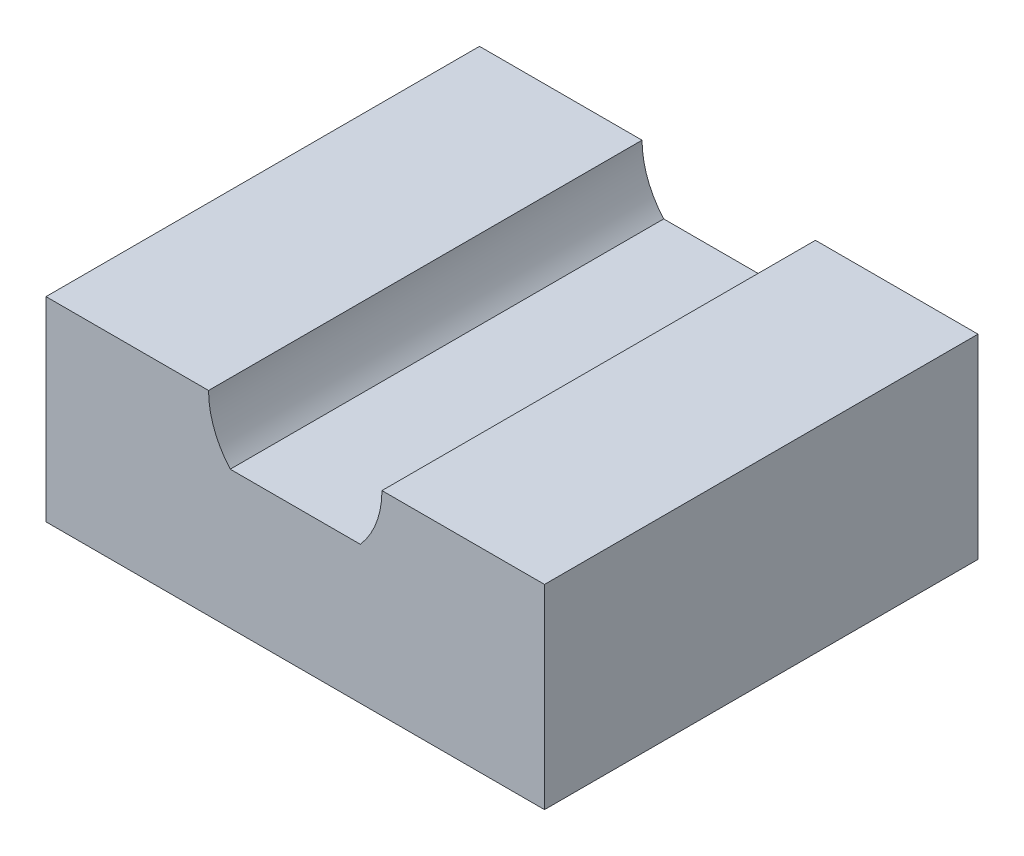
ISO-10303-21;
HEADER;
FILE_DESCRIPTION(('STEP AP214'),'2;1');
FILE_NAME('part.step','',(''),(''),'','','');
FILE_SCHEMA(('AUTOMOTIVE_DESIGN { 1 0 10303 214 1 1 1 1 }'));
ENDSEC;
DATA;
#1=APPLICATION_CONTEXT('core data for automotive mechanical design processes');
#2=APPLICATION_PROTOCOL_DEFINITION('international standard','automotive_design',2000,#1);
#3=PRODUCT_CONTEXT('',#1,'mechanical');
#4=PRODUCT('Part','Part','',(#3));
#5=PRODUCT_RELATED_PRODUCT_CATEGORY('part','',(#4));
#6=PRODUCT_DEFINITION_FORMATION('','',#4);
#7=PRODUCT_DEFINITION_CONTEXT('part definition',#1,'design');
#8=PRODUCT_DEFINITION('design','',#6,#7);
#9=PRODUCT_DEFINITION_SHAPE('','',#8);
#10=(LENGTH_UNIT() NAMED_UNIT(*) SI_UNIT(.MILLI.,.METRE.));
#11=(NAMED_UNIT(*) PLANE_ANGLE_UNIT() SI_UNIT($,.RADIAN.));
#12=(NAMED_UNIT(*) SI_UNIT($,.STERADIAN.) SOLID_ANGLE_UNIT());
#13=UNCERTAINTY_MEASURE_WITH_UNIT(LENGTH_MEASURE(1.E-05),#10,'distance_accuracy_value','');
#14=(GEOMETRIC_REPRESENTATION_CONTEXT(3) GLOBAL_UNCERTAINTY_ASSIGNED_CONTEXT((#13)) GLOBAL_UNIT_ASSIGNED_CONTEXT((#10,
#11,#12)) REPRESENTATION_CONTEXT('',''));
#15=CARTESIAN_POINT('',(0.,0.,0.));
#16=DIRECTION('',(0.,0.,1.));
#17=DIRECTION('',(1.,0.,0.));
#18=AXIS2_PLACEMENT_3D('',#15,#16,#17);
#19=CARTESIAN_POINT('',(-23.,18.,40.));
#20=DIRECTION('',(0.,-1.,0.));
#21=DIRECTION('',(0.,0.,-1.));
#22=AXIS2_PLACEMENT_3D('',#19,#20,#21);
#23=PLANE('',#22);
#24=DIRECTION('',(-1.,0.,0.));
#25=VECTOR('',#24,1.);
#26=CARTESIAN_POINT('',(-23.,18.,0.));
#27=LINE('',#26,#25);
#28=CARTESIAN_POINT('',(-8.,18.,0.));
#29=VERTEX_POINT('',#28);
#30=CARTESIAN_POINT('',(-23.,18.,0.));
#31=VERTEX_POINT('',#30);
#32=EDGE_CURVE('E132',#29,#31,#27,.T.);
#33=ORIENTED_EDGE('',*,*,#32,.T.);
#34=DIRECTION('',(0.,0.,-1.));
#35=VECTOR('',#34,1.);
#36=CARTESIAN_POINT('',(-23.,18.,40.));
#37=LINE('',#36,#35);
#38=CARTESIAN_POINT('',(-23.,18.,40.));
#39=VERTEX_POINT('',#38);
#40=EDGE_CURVE('E11',#39,#31,#37,.T.);
#41=ORIENTED_EDGE('',*,*,#40,.F.);
#42=DIRECTION('',(-1.,0.,0.));
#43=VECTOR('',#42,1.);
#44=CARTESIAN_POINT('',(-23.,18.,40.));
#45=LINE('',#44,#43);
#46=CARTESIAN_POINT('',(-8.,18.,40.));
#47=VERTEX_POINT('',#46);
#48=EDGE_CURVE('E146',#47,#39,#45,.T.);
#49=ORIENTED_EDGE('',*,*,#48,.F.);
#50=DIRECTION('',(0.,0.,-1.));
#51=VECTOR('',#50,1.);
#52=CARTESIAN_POINT('',(-8.,18.,40.));
#53=LINE('',#52,#51);
#54=EDGE_CURVE('E128',#47,#29,#53,.T.);
#55=ORIENTED_EDGE('',*,*,#54,.T.);
#56=EDGE_LOOP('',(#33,#41,#49,#55));
#57=FACE_BOUND('',#56,.T.);
#58=ADVANCED_FACE('F36',(#57),#23,.F.);
#59=CARTESIAN_POINT('',(-23.,18.,40.));
#60=DIRECTION('',(1.,0.,0.));
#61=DIRECTION('',(0.,0.,-1.));
#62=AXIS2_PLACEMENT_3D('',#59,#60,#61);
#63=PLANE('',#62);
#64=DIRECTION('',(0.,-1.,0.));
#65=VECTOR('',#64,1.);
#66=CARTESIAN_POINT('',(-23.,18.,0.));
#67=LINE('',#66,#65);
#68=CARTESIAN_POINT('',(-23.,0.,0.));
#69=VERTEX_POINT('',#68);
#70=EDGE_CURVE('E135',#31,#69,#67,.T.);
#71=ORIENTED_EDGE('',*,*,#70,.T.);
#72=DIRECTION('',(0.,0.,-1.));
#73=VECTOR('',#72,1.);
#74=CARTESIAN_POINT('',(-23.,0.,40.));
#75=LINE('',#74,#73);
#76=CARTESIAN_POINT('',(-23.,0.,40.));
#77=VERTEX_POINT('',#76);
#78=EDGE_CURVE('E44',#77,#69,#75,.T.);
#79=ORIENTED_EDGE('',*,*,#78,.F.);
#80=DIRECTION('',(0.,-1.,0.));
#81=VECTOR('',#80,1.);
#82=CARTESIAN_POINT('',(-23.,18.,40.));
#83=LINE('',#82,#81);
#84=EDGE_CURVE('E95',#39,#77,#83,.T.);
#85=ORIENTED_EDGE('',*,*,#84,.F.);
#86=ORIENTED_EDGE('',*,*,#40,.T.);
#87=EDGE_LOOP('',(#71,#79,#85,#86));
#88=FACE_BOUND('',#87,.T.);
#89=ADVANCED_FACE('F181',(#88),#63,.F.);
#90=CARTESIAN_POINT('',(-23.,0.,40.));
#91=DIRECTION('',(0.,1.,0.));
#92=DIRECTION('',(0.,0.,1.));
#93=AXIS2_PLACEMENT_3D('',#90,#91,#92);
#94=PLANE('',#93);
#95=DIRECTION('',(1.,0.,0.));
#96=VECTOR('',#95,1.);
#97=CARTESIAN_POINT('',(-23.,0.,0.));
#98=LINE('',#97,#96);
#99=CARTESIAN_POINT('',(23.,0.,0.));
#100=VERTEX_POINT('',#99);
#101=EDGE_CURVE('E137',#69,#100,#98,.T.);
#102=ORIENTED_EDGE('',*,*,#101,.T.);
#103=DIRECTION('',(0.,0.,-1.));
#104=VECTOR('',#103,1.);
#105=CARTESIAN_POINT('',(23.,0.,40.));
#106=LINE('',#105,#104);
#107=CARTESIAN_POINT('',(23.,0.,40.));
#108=VERTEX_POINT('',#107);
#109=EDGE_CURVE('E153',#108,#100,#106,.T.);
#110=ORIENTED_EDGE('',*,*,#109,.F.);
#111=DIRECTION('',(1.,0.,0.));
#112=VECTOR('',#111,1.);
#113=CARTESIAN_POINT('',(-23.,0.,40.));
#114=LINE('',#113,#112);
#115=EDGE_CURVE('E161',#77,#108,#114,.T.);
#116=ORIENTED_EDGE('',*,*,#115,.F.);
#117=ORIENTED_EDGE('',*,*,#78,.T.);
#118=EDGE_LOOP('',(#102,#110,#116,#117));
#119=FACE_BOUND('',#118,.T.);
#120=ADVANCED_FACE('F159',(#119),#94,.F.);
#121=CARTESIAN_POINT('',(23.,0.,40.));
#122=DIRECTION('',(-1.,0.,0.));
#123=DIRECTION('',(0.,0.,1.));
#124=AXIS2_PLACEMENT_3D('',#121,#122,#123);
#125=PLANE('',#124);
#126=DIRECTION('',(0.,1.,0.));
#127=VECTOR('',#126,1.);
#128=CARTESIAN_POINT('',(23.,0.,0.));
#129=LINE('',#128,#127);
#130=CARTESIAN_POINT('',(23.,18.,0.));
#131=VERTEX_POINT('',#130);
#132=EDGE_CURVE('E139',#100,#131,#129,.T.);
#133=ORIENTED_EDGE('',*,*,#132,.T.);
#134=DIRECTION('',(0.,0.,-1.));
#135=VECTOR('',#134,1.);
#136=CARTESIAN_POINT('',(23.,18.,40.));
#137=LINE('',#136,#135);
#138=CARTESIAN_POINT('',(23.,18.,40.));
#139=VERTEX_POINT('',#138);
#140=EDGE_CURVE('E150',#139,#131,#137,.T.);
#141=ORIENTED_EDGE('',*,*,#140,.F.);
#142=DIRECTION('',(0.,1.,0.));
#143=VECTOR('',#142,1.);
#144=CARTESIAN_POINT('',(23.,0.,40.));
#145=LINE('',#144,#143);
#146=EDGE_CURVE('E173',#108,#139,#145,.T.);
#147=ORIENTED_EDGE('',*,*,#146,.F.);
#148=ORIENTED_EDGE('',*,*,#109,.T.);
#149=EDGE_LOOP('',(#133,#141,#147,#148));
#150=FACE_BOUND('',#149,.T.);
#151=ADVANCED_FACE('F169',(#150),#125,.F.);
#152=CARTESIAN_POINT('',(23.,18.,40.));
#153=DIRECTION('',(0.,-1.,0.));
#154=DIRECTION('',(0.,0.,-1.));
#155=AXIS2_PLACEMENT_3D('',#152,#153,#154);
#156=PLANE('',#155);
#157=DIRECTION('',(-1.,0.,0.));
#158=VECTOR('',#157,1.);
#159=CARTESIAN_POINT('',(23.,18.,0.));
#160=LINE('',#159,#158);
#161=CARTESIAN_POINT('',(8.,18.,0.));
#162=VERTEX_POINT('',#161);
#163=EDGE_CURVE('E141',#131,#162,#160,.T.);
#164=ORIENTED_EDGE('',*,*,#163,.T.);
#165=DIRECTION('',(0.,0.,-1.));
#166=VECTOR('',#165,1.);
#167=CARTESIAN_POINT('',(8.,18.,40.));
#168=LINE('',#167,#166);
#169=CARTESIAN_POINT('',(8.,18.,40.));
#170=VERTEX_POINT('',#169);
#171=EDGE_CURVE('E123',#170,#162,#168,.T.);
#172=ORIENTED_EDGE('',*,*,#171,.F.);
#173=DIRECTION('',(-1.,0.,0.));
#174=VECTOR('',#173,1.);
#175=CARTESIAN_POINT('',(23.,18.,40.));
#176=LINE('',#175,#174);
#177=EDGE_CURVE('E114',#139,#170,#176,.T.);
#178=ORIENTED_EDGE('',*,*,#177,.F.);
#179=ORIENTED_EDGE('',*,*,#140,.T.);
#180=EDGE_LOOP('',(#164,#172,#178,#179));
#181=FACE_BOUND('',#180,.T.);
#182=ADVANCED_FACE('F172',(#181),#156,.F.);
#183=CARTESIAN_POINT('',(0.,18.,40.));
#184=DIRECTION('',(0.,0.,-1.));
#185=DIRECTION('',(-1.,0.,0.));
#186=AXIS2_PLACEMENT_3D('',#183,#184,#185);
#187=CYLINDRICAL_SURFACE('',#186,8.);
#188=CARTESIAN_POINT('',(0.,18.,0.));
#189=DIRECTION('',(0.,0.,-1.));
#190=DIRECTION('',(1.,0.,0.));
#191=AXIS2_PLACEMENT_3D('',#188,#189,#190);
#192=CIRCLE('',#191,8.);
#193=CARTESIAN_POINT('',(6.,12.7084973778708,0.));
#194=VERTEX_POINT('',#193);
#195=EDGE_CURVE('E122',#162,#194,#192,.T.);
#196=ORIENTED_EDGE('',*,*,#195,.T.);
#197=DIRECTION('',(0.,0.,-1.));
#198=VECTOR('',#197,1.);
#199=CARTESIAN_POINT('',(6.,12.7084973778708,40.));
#200=LINE('',#199,#198);
#201=CARTESIAN_POINT('',(6.,12.7084973778708,40.));
#202=VERTEX_POINT('',#201);
#203=EDGE_CURVE('E119',#202,#194,#200,.T.);
#204=ORIENTED_EDGE('',*,*,#203,.F.);
#205=CARTESIAN_POINT('',(0.,18.,40.));
#206=DIRECTION('',(0.,0.,-1.));
#207=DIRECTION('',(1.,0.,0.));
#208=AXIS2_PLACEMENT_3D('',#205,#206,#207);
#209=CIRCLE('',#208,8.);
#210=EDGE_CURVE('E108',#170,#202,#209,.T.);
#211=ORIENTED_EDGE('',*,*,#210,.F.);
#212=ORIENTED_EDGE('',*,*,#171,.T.);
#213=EDGE_LOOP('',(#196,#204,#211,#212));
#214=FACE_BOUND('',#213,.T.);
#215=ADVANCED_FACE('F120',(#214),#187,.F.);
#216=CARTESIAN_POINT('',(-6.,12.7084973778708,40.));
#217=DIRECTION('',(0.,-1.,0.));
#218=DIRECTION('',(0.,0.,-1.));
#219=AXIS2_PLACEMENT_3D('',#216,#217,#218);
#220=PLANE('',#219);
#221=DIRECTION('',(-1.,0.,0.));
#222=VECTOR('',#221,1.);
#223=CARTESIAN_POINT('',(-6.,12.7084973778708,0.));
#224=LINE('',#223,#222);
#225=CARTESIAN_POINT('',(-6.,12.7084973778708,0.));
#226=VERTEX_POINT('',#225);
#227=EDGE_CURVE('E81',#194,#226,#224,.T.);
#228=ORIENTED_EDGE('',*,*,#227,.T.);
#229=DIRECTION('',(0.,0.,-1.));
#230=VECTOR('',#229,1.);
#231=CARTESIAN_POINT('',(-6.,12.7084973778708,40.));
#232=LINE('',#231,#230);
#233=CARTESIAN_POINT('',(-6.,12.7084973778708,40.));
#234=VERTEX_POINT('',#233);
#235=EDGE_CURVE('E124',#234,#226,#232,.T.);
#236=ORIENTED_EDGE('',*,*,#235,.F.);
#237=DIRECTION('',(-1.,0.,0.));
#238=VECTOR('',#237,1.);
#239=CARTESIAN_POINT('',(-6.,12.7084973778708,40.));
#240=LINE('',#239,#238);
#241=EDGE_CURVE('E112',#202,#234,#240,.T.);
#242=ORIENTED_EDGE('',*,*,#241,.F.);
#243=ORIENTED_EDGE('',*,*,#203,.T.);
#244=EDGE_LOOP('',(#228,#236,#242,#243));
#245=FACE_BOUND('',#244,.T.);
#246=ADVANCED_FACE('F126',(#245),#220,.F.);
#247=CARTESIAN_POINT('',(0.,18.,40.));
#248=DIRECTION('',(0.,0.,-1.));
#249=DIRECTION('',(-1.,0.,0.));
#250=AXIS2_PLACEMENT_3D('',#247,#248,#249);
#251=CYLINDRICAL_SURFACE('',#250,8.);
#252=CARTESIAN_POINT('',(0.,18.,0.));
#253=DIRECTION('',(0.,0.,-1.));
#254=DIRECTION('',(1.,0.,0.));
#255=AXIS2_PLACEMENT_3D('',#252,#253,#254);
#256=CIRCLE('',#255,8.);
#257=EDGE_CURVE('E87',#226,#29,#256,.T.);
#258=ORIENTED_EDGE('',*,*,#257,.T.);
#259=ORIENTED_EDGE('',*,*,#54,.F.);
#260=CARTESIAN_POINT('',(0.,18.,40.));
#261=DIRECTION('',(0.,0.,-1.));
#262=DIRECTION('',(1.,0.,0.));
#263=AXIS2_PLACEMENT_3D('',#260,#261,#262);
#264=CIRCLE('',#263,8.);
#265=EDGE_CURVE('E52',#234,#47,#264,.T.);
#266=ORIENTED_EDGE('',*,*,#265,.F.);
#267=ORIENTED_EDGE('',*,*,#235,.T.);
#268=EDGE_LOOP('',(#258,#259,#266,#267));
#269=FACE_BOUND('',#268,.T.);
#270=ADVANCED_FACE('F197',(#269),#251,.F.);
#271=CARTESIAN_POINT('',(0.,18.,40.));
#272=DIRECTION('',(0.,0.,1.));
#273=DIRECTION('',(1.,0.,0.));
#274=AXIS2_PLACEMENT_3D('',#271,#272,#273);
#275=PLANE('',#274);
#276=ORIENTED_EDGE('',*,*,#48,.T.);
#277=ORIENTED_EDGE('',*,*,#84,.T.);
#278=ORIENTED_EDGE('',*,*,#115,.T.);
#279=ORIENTED_EDGE('',*,*,#146,.T.);
#280=ORIENTED_EDGE('',*,*,#177,.T.);
#281=ORIENTED_EDGE('',*,*,#210,.T.);
#282=ORIENTED_EDGE('',*,*,#241,.T.);
#283=ORIENTED_EDGE('',*,*,#265,.T.);
#284=EDGE_LOOP('',(#276,#277,#278,#279,#280,#281,#282,#283));
#285=FACE_BOUND('',#284,.T.);
#286=ADVANCED_FACE('F110',(#285),#275,.T.);
#287=CARTESIAN_POINT('',(0.,18.,0.));
#288=DIRECTION('',(0.,0.,1.));
#289=DIRECTION('',(1.,0.,0.));
#290=AXIS2_PLACEMENT_3D('',#287,#288,#289);
#291=PLANE('',#290);
#292=ORIENTED_EDGE('',*,*,#32,.F.);
#293=ORIENTED_EDGE('',*,*,#257,.F.);
#294=ORIENTED_EDGE('',*,*,#227,.F.);
#295=ORIENTED_EDGE('',*,*,#195,.F.);
#296=ORIENTED_EDGE('',*,*,#163,.F.);
#297=ORIENTED_EDGE('',*,*,#132,.F.);
#298=ORIENTED_EDGE('',*,*,#101,.F.);
#299=ORIENTED_EDGE('',*,*,#70,.F.);
#300=EDGE_LOOP('',(#292,#293,#294,#295,#296,#297,#298,#299));
#301=FACE_BOUND('',#300,.T.);
#302=ADVANCED_FACE('F165',(#301),#291,.F.);
#303=CLOSED_SHELL('',(#58,#89,#120,#151,#182,#215,#246,#270,#286,#302));
#304=MANIFOLD_SOLID_BREP('B2',#303);
#305=ADVANCED_BREP_SHAPE_REPRESENTATION('',(#18,#304),#14);
#306=SHAPE_DEFINITION_REPRESENTATION(#9,#305);
ENDSEC;
END-ISO-10303-21;
